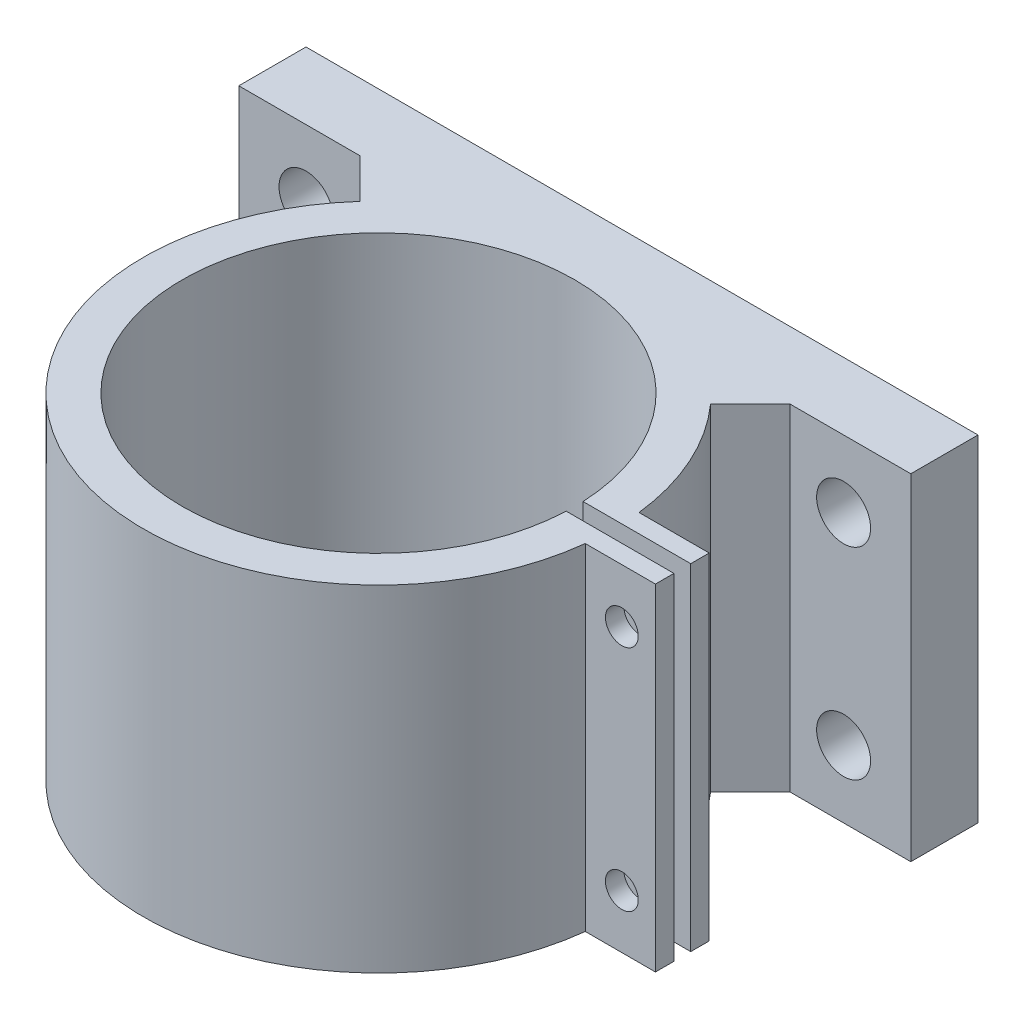
ISO-10303-21;
HEADER;
FILE_DESCRIPTION(('STEP AP214'),'2;1');
FILE_NAME('part.step','',(''),(''),'','','');
FILE_SCHEMA(('AUTOMOTIVE_DESIGN { 1 0 10303 214 1 1 1 1 }'));
ENDSEC;
DATA;
#1=APPLICATION_CONTEXT('core data for automotive mechanical design processes');
#2=APPLICATION_PROTOCOL_DEFINITION('international standard','automotive_design',2000,#1);
#3=PRODUCT_CONTEXT('',#1,'mechanical');
#4=PRODUCT('Part','Part','',(#3));
#5=PRODUCT_RELATED_PRODUCT_CATEGORY('part','',(#4));
#6=PRODUCT_DEFINITION_FORMATION('','',#4);
#7=PRODUCT_DEFINITION_CONTEXT('part definition',#1,'design');
#8=PRODUCT_DEFINITION('design','',#6,#7);
#9=PRODUCT_DEFINITION_SHAPE('','',#8);
#10=(LENGTH_UNIT() NAMED_UNIT(*) SI_UNIT(.MILLI.,.METRE.));
#11=(NAMED_UNIT(*) PLANE_ANGLE_UNIT() SI_UNIT($,.RADIAN.));
#12=(NAMED_UNIT(*) SI_UNIT($,.STERADIAN.) SOLID_ANGLE_UNIT());
#13=UNCERTAINTY_MEASURE_WITH_UNIT(LENGTH_MEASURE(1.E-05),#10,'distance_accuracy_value','');
#14=(GEOMETRIC_REPRESENTATION_CONTEXT(3) GLOBAL_UNCERTAINTY_ASSIGNED_CONTEXT((#13)) GLOBAL_UNIT_ASSIGNED_CONTEXT((#10,
#11,#12)) REPRESENTATION_CONTEXT('',''));
#15=CARTESIAN_POINT('',(0.,0.,0.));
#16=DIRECTION('',(0.,0.,1.));
#17=DIRECTION('',(1.,0.,0.));
#18=AXIS2_PLACEMENT_3D('',#15,#16,#17);
#19=CARTESIAN_POINT('',(28.71,31.75,0.));
#20=DIRECTION('',(1.,0.,0.));
#21=DIRECTION('',(0.,0.,-1.));
#22=AXIS2_PLACEMENT_3D('',#19,#20,#21);
#23=PLANE('',#22);
#24=DIRECTION('',(0.,-1.,0.));
#25=VECTOR('',#24,1.);
#26=CARTESIAN_POINT('',(28.71,31.75,0.79375));
#27=LINE('',#26,#25);
#28=CARTESIAN_POINT('',(28.71,31.75,0.79375));
#29=VERTEX_POINT('',#28);
#30=CARTESIAN_POINT('',(28.71,0.,0.79375));
#31=VERTEX_POINT('',#30);
#32=EDGE_CURVE('E64',#29,#31,#27,.T.);
#33=ORIENTED_EDGE('',*,*,#32,.F.);
#34=DIRECTION('',(0.,0.,1.));
#35=VECTOR('',#34,1.);
#36=CARTESIAN_POINT('',(28.71,31.75,0.));
#37=LINE('',#36,#35);
#38=CARTESIAN_POINT('',(28.71,31.75,2.54));
#39=VERTEX_POINT('',#38);
#40=EDGE_CURVE('E177',#29,#39,#37,.T.);
#41=ORIENTED_EDGE('',*,*,#40,.T.);
#42=DIRECTION('',(0.,-1.,0.));
#43=VECTOR('',#42,1.);
#44=CARTESIAN_POINT('',(28.71,31.75,2.54));
#45=LINE('',#44,#43);
#46=CARTESIAN_POINT('',(28.71,0.,2.54));
#47=VERTEX_POINT('',#46);
#48=EDGE_CURVE('E230',#39,#47,#45,.T.);
#49=ORIENTED_EDGE('',*,*,#48,.T.);
#50=DIRECTION('',(0.,0.,1.));
#51=VECTOR('',#50,1.);
#52=CARTESIAN_POINT('',(28.71,0.,0.));
#53=LINE('',#52,#51);
#54=EDGE_CURVE('E213',#31,#47,#53,.T.);
#55=ORIENTED_EDGE('',*,*,#54,.F.);
#56=EDGE_LOOP('',(#33,#41,#49,#55));
#57=FACE_BOUND('',#56,.T.);
#58=ADVANCED_FACE('F39',(#57),#23,.T.);
#59=CARTESIAN_POINT('',(0.884999999999858,31.75,0.884999999999871));
#60=DIRECTION('',(0.707106781186543,0.,0.707106781186552));
#61=DIRECTION('',(0.707106781186552,0.,-0.707106781186543));
#62=AXIS2_PLACEMENT_3D('',#59,#60,#61);
#63=PLANE('',#62);
#64=DIRECTION('',(-0.707106781186552,0.,0.707106781186543));
#65=VECTOR('',#64,1.);
#66=CARTESIAN_POINT('',(0.884999999999858,0.,0.884999999999871));
#67=LINE('',#66,#65);
#68=CARTESIAN_POINT('',(20.32,0.,-18.55));
#69=VERTEX_POINT('',#68);
#70=CARTESIAN_POINT('',(16.5755094722893,0.,-14.8055094722893));
#71=VERTEX_POINT('',#70);
#72=EDGE_CURVE('E188',#69,#71,#67,.T.);
#73=ORIENTED_EDGE('',*,*,#72,.F.);
#74=DIRECTION('',(0.,-1.,0.));
#75=VECTOR('',#74,1.);
#76=CARTESIAN_POINT('',(20.32,31.75,-18.55));
#77=LINE('',#76,#75);
#78=CARTESIAN_POINT('',(20.32,31.75,-18.55));
#79=VERTEX_POINT('',#78);
#80=EDGE_CURVE('E249',#79,#69,#77,.T.);
#81=ORIENTED_EDGE('',*,*,#80,.F.);
#82=DIRECTION('',(-0.707106781186552,0.,0.707106781186543));
#83=VECTOR('',#82,1.);
#84=CARTESIAN_POINT('',(0.884999999999858,31.75,0.884999999999871));
#85=LINE('',#84,#83);
#86=CARTESIAN_POINT('',(16.5755094722893,31.75,-14.8055094722893));
#87=VERTEX_POINT('',#86);
#88=EDGE_CURVE('E225',#79,#87,#85,.T.);
#89=ORIENTED_EDGE('',*,*,#88,.T.);
#90=DIRECTION('',(0.,-1.,0.));
#91=VECTOR('',#90,1.);
#92=CARTESIAN_POINT('',(16.5755094722893,31.75,-14.8055094722893));
#93=LINE('',#92,#91);
#94=EDGE_CURVE('E187',#87,#71,#93,.T.);
#95=ORIENTED_EDGE('',*,*,#94,.T.);
#96=EDGE_LOOP('',(#73,#81,#89,#95));
#97=FACE_BOUND('',#96,.T.);
#98=ADVANCED_FACE('F41',(#97),#63,.T.);
#99=CARTESIAN_POINT('',(0.,31.75,-18.55));
#100=DIRECTION('',(0.,0.,-1.));
#101=DIRECTION('',(-1.,0.,0.));
#102=AXIS2_PLACEMENT_3D('',#99,#100,#101);
#103=PLANE('',#102);
#104=CARTESIAN_POINT('',(25.4,6.35000000000001,-18.55));
#105=DIRECTION('',(0.,0.,1.));
#106=DIRECTION('',(1.,0.,0.));
#107=AXIS2_PLACEMENT_3D('',#104,#105,#106);
#108=CIRCLE('',#107,2.55);
#109=CARTESIAN_POINT('',(27.95,6.35000000000001,-18.55));
#110=VERTEX_POINT('',#109);
#111=EDGE_CURVE('E397',#110,#110,#108,.T.);
#112=ORIENTED_EDGE('',*,*,#111,.F.);
#113=EDGE_LOOP('',(#112));
#114=FACE_BOUND('',#113,.T.);
#115=CARTESIAN_POINT('',(25.4,25.4,-18.55));
#116=DIRECTION('',(0.,0.,1.));
#117=DIRECTION('',(1.,0.,0.));
#118=AXIS2_PLACEMENT_3D('',#115,#116,#117);
#119=CIRCLE('',#118,2.55);
#120=CARTESIAN_POINT('',(27.95,25.4,-18.55));
#121=VERTEX_POINT('',#120);
#122=EDGE_CURVE('E401',#121,#121,#119,.T.);
#123=ORIENTED_EDGE('',*,*,#122,.F.);
#124=EDGE_LOOP('',(#123));
#125=FACE_BOUND('',#124,.T.);
#126=DIRECTION('',(1.,0.,0.));
#127=VECTOR('',#126,1.);
#128=CARTESIAN_POINT('',(0.,0.,-18.55));
#129=LINE('',#128,#127);
#130=CARTESIAN_POINT('',(31.75,0.,-18.55));
#131=VERTEX_POINT('',#130);
#132=EDGE_CURVE('E191',#69,#131,#129,.T.);
#133=ORIENTED_EDGE('',*,*,#132,.T.);
#134=DIRECTION('',(0.,-1.,0.));
#135=VECTOR('',#134,1.);
#136=CARTESIAN_POINT('',(31.75,31.75,-18.55));
#137=LINE('',#136,#135);
#138=CARTESIAN_POINT('',(31.75,31.75,-18.55));
#139=VERTEX_POINT('',#138);
#140=EDGE_CURVE('E247',#139,#131,#137,.T.);
#141=ORIENTED_EDGE('',*,*,#140,.F.);
#142=DIRECTION('',(1.,0.,0.));
#143=VECTOR('',#142,1.);
#144=CARTESIAN_POINT('',(0.,31.75,-18.55));
#145=LINE('',#144,#143);
#146=EDGE_CURVE('E296',#79,#139,#145,.T.);
#147=ORIENTED_EDGE('',*,*,#146,.F.);
#148=ORIENTED_EDGE('',*,*,#80,.T.);
#149=EDGE_LOOP('',(#133,#141,#147,#148));
#150=FACE_BOUND('',#149,.T.);
#151=ADVANCED_FACE('F350',(#114,#125,#150),#103,.F.);
#152=CARTESIAN_POINT('',(31.75,31.75,0.));
#153=DIRECTION('',(1.,0.,0.));
#154=DIRECTION('',(0.,0.,-1.));
#155=AXIS2_PLACEMENT_3D('',#152,#153,#154);
#156=PLANE('',#155);
#157=DIRECTION('',(0.,0.,1.));
#158=VECTOR('',#157,1.);
#159=CARTESIAN_POINT('',(31.75,0.,0.));
#160=LINE('',#159,#158);
#161=CARTESIAN_POINT('',(31.75,0.,-24.9));
#162=VERTEX_POINT('',#161);
#163=EDGE_CURVE('E194',#162,#131,#160,.T.);
#164=ORIENTED_EDGE('',*,*,#163,.F.);
#165=DIRECTION('',(0.,-1.,0.));
#166=VECTOR('',#165,1.);
#167=CARTESIAN_POINT('',(31.75,31.75,-24.9));
#168=LINE('',#167,#166);
#169=CARTESIAN_POINT('',(31.75,31.75,-24.9));
#170=VERTEX_POINT('',#169);
#171=EDGE_CURVE('E245',#170,#162,#168,.T.);
#172=ORIENTED_EDGE('',*,*,#171,.F.);
#173=DIRECTION('',(0.,0.,1.));
#174=VECTOR('',#173,1.);
#175=CARTESIAN_POINT('',(31.75,31.75,0.));
#176=LINE('',#175,#174);
#177=EDGE_CURVE('E298',#170,#139,#176,.T.);
#178=ORIENTED_EDGE('',*,*,#177,.T.);
#179=ORIENTED_EDGE('',*,*,#140,.T.);
#180=EDGE_LOOP('',(#164,#172,#178,#179));
#181=FACE_BOUND('',#180,.T.);
#182=ADVANCED_FACE('F385',(#181),#156,.T.);
#183=CARTESIAN_POINT('',(0.,31.75,-24.9));
#184=DIRECTION('',(0.,0.,-1.));
#185=DIRECTION('',(-1.,0.,0.));
#186=AXIS2_PLACEMENT_3D('',#183,#184,#185);
#187=PLANE('',#186);
#188=CARTESIAN_POINT('',(25.4,6.35000000000001,-24.9));
#189=DIRECTION('',(0.,0.,-1.));
#190=DIRECTION('',(-1.,0.,0.));
#191=AXIS2_PLACEMENT_3D('',#188,#189,#190);
#192=CIRCLE('',#191,2.55);
#193=CARTESIAN_POINT('',(22.85,6.35000000000001,-24.9));
#194=VERTEX_POINT('',#193);
#195=EDGE_CURVE('E43',#194,#194,#192,.T.);
#196=ORIENTED_EDGE('',*,*,#195,.F.);
#197=EDGE_LOOP('',(#196));
#198=FACE_BOUND('',#197,.T.);
#199=CARTESIAN_POINT('',(25.4,25.4,-24.9));
#200=DIRECTION('',(0.,0.,-1.));
#201=DIRECTION('',(-1.,0.,0.));
#202=AXIS2_PLACEMENT_3D('',#199,#200,#201);
#203=CIRCLE('',#202,2.55);
#204=CARTESIAN_POINT('',(22.85,25.4,-24.9));
#205=VERTEX_POINT('',#204);
#206=EDGE_CURVE('E259',#205,#205,#203,.T.);
#207=ORIENTED_EDGE('',*,*,#206,.F.);
#208=EDGE_LOOP('',(#207));
#209=FACE_BOUND('',#208,.T.);
#210=CARTESIAN_POINT('',(-25.4,25.4,-24.9));
#211=DIRECTION('',(0.,0.,-1.));
#212=DIRECTION('',(-1.,0.,0.));
#213=AXIS2_PLACEMENT_3D('',#210,#211,#212);
#214=CIRCLE('',#213,2.55);
#215=CARTESIAN_POINT('',(-27.95,25.4,-24.9));
#216=VERTEX_POINT('',#215);
#217=EDGE_CURVE('E261',#216,#216,#214,.T.);
#218=ORIENTED_EDGE('',*,*,#217,.F.);
#219=EDGE_LOOP('',(#218));
#220=FACE_BOUND('',#219,.T.);
#221=CARTESIAN_POINT('',(-25.4,6.35,-24.9));
#222=DIRECTION('',(0.,0.,-1.));
#223=DIRECTION('',(-1.,0.,0.));
#224=AXIS2_PLACEMENT_3D('',#221,#222,#223);
#225=CIRCLE('',#224,2.55);
#226=CARTESIAN_POINT('',(-27.95,6.35,-24.9));
#227=VERTEX_POINT('',#226);
#228=EDGE_CURVE('E267',#227,#227,#225,.T.);
#229=ORIENTED_EDGE('',*,*,#228,.F.);
#230=EDGE_LOOP('',(#229));
#231=FACE_BOUND('',#230,.T.);
#232=DIRECTION('',(1.,0.,0.));
#233=VECTOR('',#232,1.);
#234=CARTESIAN_POINT('',(0.,0.,-24.9));
#235=LINE('',#234,#233);
#236=CARTESIAN_POINT('',(-31.75,0.,-24.9));
#237=VERTEX_POINT('',#236);
#238=EDGE_CURVE('E197',#237,#162,#235,.T.);
#239=ORIENTED_EDGE('',*,*,#238,.F.);
#240=DIRECTION('',(0.,-1.,0.));
#241=VECTOR('',#240,1.);
#242=CARTESIAN_POINT('',(-31.75,31.75,-24.9));
#243=LINE('',#242,#241);
#244=CARTESIAN_POINT('',(-31.75,31.75,-24.9));
#245=VERTEX_POINT('',#244);
#246=EDGE_CURVE('E243',#245,#237,#243,.T.);
#247=ORIENTED_EDGE('',*,*,#246,.F.);
#248=DIRECTION('',(1.,0.,0.));
#249=VECTOR('',#248,1.);
#250=CARTESIAN_POINT('',(0.,31.75,-24.9));
#251=LINE('',#250,#249);
#252=EDGE_CURVE('E301',#245,#170,#251,.T.);
#253=ORIENTED_EDGE('',*,*,#252,.T.);
#254=ORIENTED_EDGE('',*,*,#171,.T.);
#255=EDGE_LOOP('',(#239,#247,#253,#254));
#256=FACE_BOUND('',#255,.T.);
#257=ADVANCED_FACE('F381',(#198,#209,#220,#231,#256),#187,.T.);
#258=CARTESIAN_POINT('',(-31.75,31.75,0.));
#259=DIRECTION('',(-1.,0.,0.));
#260=DIRECTION('',(0.,0.,1.));
#261=AXIS2_PLACEMENT_3D('',#258,#259,#260);
#262=PLANE('',#261);
#263=DIRECTION('',(0.,0.,-1.));
#264=VECTOR('',#263,1.);
#265=CARTESIAN_POINT('',(-31.75,0.,0.));
#266=LINE('',#265,#264);
#267=CARTESIAN_POINT('',(-31.75,0.,-18.55));
#268=VERTEX_POINT('',#267);
#269=EDGE_CURVE('E200',#268,#237,#266,.T.);
#270=ORIENTED_EDGE('',*,*,#269,.F.);
#271=DIRECTION('',(0.,-1.,0.));
#272=VECTOR('',#271,1.);
#273=CARTESIAN_POINT('',(-31.75,31.75,-18.55));
#274=LINE('',#273,#272);
#275=CARTESIAN_POINT('',(-31.75,31.75,-18.55));
#276=VERTEX_POINT('',#275);
#277=EDGE_CURVE('E241',#276,#268,#274,.T.);
#278=ORIENTED_EDGE('',*,*,#277,.F.);
#279=DIRECTION('',(0.,0.,-1.));
#280=VECTOR('',#279,1.);
#281=CARTESIAN_POINT('',(-31.75,31.75,0.));
#282=LINE('',#281,#280);
#283=EDGE_CURVE('E304',#276,#245,#282,.T.);
#284=ORIENTED_EDGE('',*,*,#283,.T.);
#285=ORIENTED_EDGE('',*,*,#246,.T.);
#286=EDGE_LOOP('',(#270,#278,#284,#285));
#287=FACE_BOUND('',#286,.T.);
#288=ADVANCED_FACE('F377',(#287),#262,.T.);
#289=CARTESIAN_POINT('',(0.,31.75,-18.55));
#290=DIRECTION('',(0.,0.,1.));
#291=DIRECTION('',(1.,0.,0.));
#292=AXIS2_PLACEMENT_3D('',#289,#290,#291);
#293=PLANE('',#292);
#294=CARTESIAN_POINT('',(-25.4,25.4,-18.55));
#295=DIRECTION('',(0.,0.,1.));
#296=DIRECTION('',(1.,0.,0.));
#297=AXIS2_PLACEMENT_3D('',#294,#295,#296);
#298=CIRCLE('',#297,2.55);
#299=CARTESIAN_POINT('',(-22.85,25.4,-18.55));
#300=VERTEX_POINT('',#299);
#301=EDGE_CURVE('E426',#300,#300,#298,.T.);
#302=ORIENTED_EDGE('',*,*,#301,.F.);
#303=EDGE_LOOP('',(#302));
#304=FACE_BOUND('',#303,.T.);
#305=CARTESIAN_POINT('',(-25.4,6.35,-18.55));
#306=DIRECTION('',(0.,0.,1.));
#307=DIRECTION('',(1.,0.,0.));
#308=AXIS2_PLACEMENT_3D('',#305,#306,#307);
#309=CIRCLE('',#308,2.55);
#310=CARTESIAN_POINT('',(-22.85,6.35,-18.55));
#311=VERTEX_POINT('',#310);
#312=EDGE_CURVE('E272',#311,#311,#309,.T.);
#313=ORIENTED_EDGE('',*,*,#312,.F.);
#314=EDGE_LOOP('',(#313));
#315=FACE_BOUND('',#314,.T.);
#316=DIRECTION('',(-1.,0.,0.));
#317=VECTOR('',#316,1.);
#318=CARTESIAN_POINT('',(0.,0.,-18.55));
#319=LINE('',#318,#317);
#320=CARTESIAN_POINT('',(-20.32,0.,-18.55));
#321=VERTEX_POINT('',#320);
#322=EDGE_CURVE('E203',#321,#268,#319,.T.);
#323=ORIENTED_EDGE('',*,*,#322,.F.);
#324=DIRECTION('',(0.,-1.,0.));
#325=VECTOR('',#324,1.);
#326=CARTESIAN_POINT('',(-20.32,31.75,-18.55));
#327=LINE('',#326,#325);
#328=CARTESIAN_POINT('',(-20.32,31.75,-18.55));
#329=VERTEX_POINT('',#328);
#330=EDGE_CURVE('E239',#329,#321,#327,.T.);
#331=ORIENTED_EDGE('',*,*,#330,.F.);
#332=DIRECTION('',(-1.,0.,0.));
#333=VECTOR('',#332,1.);
#334=CARTESIAN_POINT('',(0.,31.75,-18.55));
#335=LINE('',#334,#333);
#336=EDGE_CURVE('E307',#329,#276,#335,.T.);
#337=ORIENTED_EDGE('',*,*,#336,.T.);
#338=ORIENTED_EDGE('',*,*,#277,.T.);
#339=EDGE_LOOP('',(#323,#331,#337,#338));
#340=FACE_BOUND('',#339,.T.);
#341=ADVANCED_FACE('F373',(#304,#315,#340),#293,.T.);
#342=CARTESIAN_POINT('',(-0.884999999999903,31.75,0.884999999999912));
#343=DIRECTION('',(0.707106781186544,0.,-0.707106781186551));
#344=DIRECTION('',(-0.707106781186551,0.,-0.707106781186544));
#345=AXIS2_PLACEMENT_3D('',#342,#343,#344);
#346=PLANE('',#345);
#347=DIRECTION('',(0.707106781186551,0.,0.707106781186544));
#348=VECTOR('',#347,1.);
#349=CARTESIAN_POINT('',(-0.884999999999903,0.,0.884999999999912));
#350=LINE('',#349,#348);
#351=CARTESIAN_POINT('',(-16.5755094722893,0.,-14.8055094722893));
#352=VERTEX_POINT('',#351);
#353=EDGE_CURVE('E206',#321,#352,#350,.T.);
#354=ORIENTED_EDGE('',*,*,#353,.T.);
#355=DIRECTION('',(0.,-1.,0.));
#356=VECTOR('',#355,1.);
#357=CARTESIAN_POINT('',(-16.5755094722893,31.75,-14.8055094722893));
#358=LINE('',#357,#356);
#359=CARTESIAN_POINT('',(-16.5755094722893,31.75,-14.8055094722893));
#360=VERTEX_POINT('',#359);
#361=EDGE_CURVE('E236',#360,#352,#358,.T.);
#362=ORIENTED_EDGE('',*,*,#361,.F.);
#363=DIRECTION('',(0.707106781186551,0.,0.707106781186544));
#364=VECTOR('',#363,1.);
#365=CARTESIAN_POINT('',(-0.884999999999903,31.75,0.884999999999912));
#366=LINE('',#365,#364);
#367=EDGE_CURVE('E310',#329,#360,#366,.T.);
#368=ORIENTED_EDGE('',*,*,#367,.F.);
#369=ORIENTED_EDGE('',*,*,#330,.T.);
#370=EDGE_LOOP('',(#354,#362,#368,#369));
#371=FACE_BOUND('',#370,.T.);
#372=ADVANCED_FACE('F365',(#371),#346,.F.);
#373=CARTESIAN_POINT('',(0.,31.75,0.));
#374=DIRECTION('',(0.,-1.,0.));
#375=DIRECTION('',(0.,0.,-1.));
#376=AXIS2_PLACEMENT_3D('',#373,#374,#375);
#377=CYLINDRICAL_SURFACE('',#376,22.225);
#378=CARTESIAN_POINT('',(0.,0.,0.));
#379=DIRECTION('',(0.,1.,0.));
#380=DIRECTION('',(0.,0.,1.));
#381=AXIS2_PLACEMENT_3D('',#378,#379,#380);
#382=CIRCLE('',#381,22.225);
#383=CARTESIAN_POINT('',(22.0793800864064,0.,2.54));
#384=VERTEX_POINT('',#383);
#385=EDGE_CURVE('E208',#352,#384,#382,.T.);
#386=ORIENTED_EDGE('',*,*,#385,.T.);
#387=DIRECTION('',(0.,-1.,0.));
#388=VECTOR('',#387,1.);
#389=CARTESIAN_POINT('',(22.0793800864064,31.75,2.54));
#390=LINE('',#389,#388);
#391=CARTESIAN_POINT('',(22.0793800864064,31.75,2.54));
#392=VERTEX_POINT('',#391);
#393=EDGE_CURVE('E233',#392,#384,#390,.T.);
#394=ORIENTED_EDGE('',*,*,#393,.F.);
#395=CARTESIAN_POINT('',(0.,31.75,0.));
#396=DIRECTION('',(0.,1.,0.));
#397=DIRECTION('',(0.,0.,1.));
#398=AXIS2_PLACEMENT_3D('',#395,#396,#397);
#399=CIRCLE('',#398,22.225);
#400=EDGE_CURVE('E311',#360,#392,#399,.T.);
#401=ORIENTED_EDGE('',*,*,#400,.F.);
#402=ORIENTED_EDGE('',*,*,#361,.T.);
#403=EDGE_LOOP('',(#386,#394,#401,#402));
#404=FACE_BOUND('',#403,.T.);
#405=ADVANCED_FACE('F359',(#404),#377,.T.);
#406=CARTESIAN_POINT('',(0.,31.75,2.54));
#407=DIRECTION('',(0.,0.,-1.));
#408=DIRECTION('',(-1.,0.,0.));
#409=AXIS2_PLACEMENT_3D('',#406,#407,#408);
#410=PLANE('',#409);
#411=CARTESIAN_POINT('',(25.535,5.08,2.54));
#412=DIRECTION('',(0.,0.,1.));
#413=DIRECTION('',(1.,0.,0.));
#414=AXIS2_PLACEMENT_3D('',#411,#412,#413);
#415=CIRCLE('',#414,1.55);
#416=CARTESIAN_POINT('',(27.085,5.08,2.54));
#417=VERTEX_POINT('',#416);
#418=EDGE_CURVE('E276',#417,#417,#415,.T.);
#419=ORIENTED_EDGE('',*,*,#418,.F.);
#420=EDGE_LOOP('',(#419));
#421=FACE_BOUND('',#420,.T.);
#422=CARTESIAN_POINT('',(25.535,26.67,2.54));
#423=DIRECTION('',(0.,0.,1.));
#424=DIRECTION('',(1.,0.,0.));
#425=AXIS2_PLACEMENT_3D('',#422,#423,#424);
#426=CIRCLE('',#425,1.55);
#427=CARTESIAN_POINT('',(27.085,26.67,2.54));
#428=VERTEX_POINT('',#427);
#429=EDGE_CURVE('E265',#428,#428,#426,.T.);
#430=ORIENTED_EDGE('',*,*,#429,.F.);
#431=EDGE_LOOP('',(#430));
#432=FACE_BOUND('',#431,.T.);
#433=DIRECTION('',(1.,0.,0.));
#434=VECTOR('',#433,1.);
#435=CARTESIAN_POINT('',(0.,0.,2.54));
#436=LINE('',#435,#434);
#437=EDGE_CURVE('E210',#384,#47,#436,.T.);
#438=ORIENTED_EDGE('',*,*,#437,.T.);
#439=ORIENTED_EDGE('',*,*,#48,.F.);
#440=DIRECTION('',(1.,0.,0.));
#441=VECTOR('',#440,1.);
#442=CARTESIAN_POINT('',(0.,31.75,2.54));
#443=LINE('',#442,#441);
#444=EDGE_CURVE('E181',#392,#39,#443,.T.);
#445=ORIENTED_EDGE('',*,*,#444,.F.);
#446=ORIENTED_EDGE('',*,*,#393,.T.);
#447=EDGE_LOOP('',(#438,#439,#445,#446));
#448=FACE_BOUND('',#447,.T.);
#449=ADVANCED_FACE('F319',(#421,#432,#448),#410,.F.);
#450=DIRECTION('',(0.,1.,0.));
#451=VECTOR('',#450,1.);
#452=CARTESIAN_POINT('',(28.71,31.75,-0.79375));
#453=LINE('',#452,#451);
#454=CARTESIAN_POINT('',(28.71,0.,-0.79375));
#455=VERTEX_POINT('',#454);
#456=CARTESIAN_POINT('',(28.71,31.75,-0.79375));
#457=VERTEX_POINT('',#456);
#458=EDGE_CURVE('E151',#455,#457,#453,.T.);
#459=ORIENTED_EDGE('',*,*,#458,.F.);
#460=CARTESIAN_POINT('',(28.71,0.,-2.54));
#461=VERTEX_POINT('',#460);
#462=EDGE_CURVE('E214',#461,#455,#53,.T.);
#463=ORIENTED_EDGE('',*,*,#462,.F.);
#464=DIRECTION('',(0.,-1.,0.));
#465=VECTOR('',#464,1.);
#466=CARTESIAN_POINT('',(28.71,31.75,-2.54));
#467=LINE('',#466,#465);
#468=CARTESIAN_POINT('',(28.71,31.75,-2.54));
#469=VERTEX_POINT('',#468);
#470=EDGE_CURVE('E175',#469,#461,#467,.T.);
#471=ORIENTED_EDGE('',*,*,#470,.F.);
#472=EDGE_CURVE('E167',#469,#457,#37,.T.);
#473=ORIENTED_EDGE('',*,*,#472,.T.);
#474=EDGE_LOOP('',(#459,#463,#471,#473));
#475=FACE_BOUND('',#474,.T.);
#476=ADVANCED_FACE('F174',(#475),#23,.T.);
#477=CARTESIAN_POINT('',(0.,31.75,-2.54));
#478=DIRECTION('',(0.,0.,-1.));
#479=DIRECTION('',(-1.,0.,0.));
#480=AXIS2_PLACEMENT_3D('',#477,#478,#479);
#481=PLANE('',#480);
#482=CARTESIAN_POINT('',(25.535,5.08,-2.54));
#483=DIRECTION('',(0.,0.,-1.));
#484=DIRECTION('',(-1.,0.,0.));
#485=AXIS2_PLACEMENT_3D('',#482,#483,#484);
#486=CIRCLE('',#485,1.55);
#487=CARTESIAN_POINT('',(23.985,5.08,-2.54));
#488=VERTEX_POINT('',#487);
#489=EDGE_CURVE('E256',#488,#488,#486,.F.);
#490=ORIENTED_EDGE('',*,*,#489,.T.);
#491=EDGE_LOOP('',(#490));
#492=FACE_BOUND('',#491,.T.);
#493=CARTESIAN_POINT('',(25.535,26.67,-2.54));
#494=DIRECTION('',(0.,0.,-1.));
#495=DIRECTION('',(-1.,0.,0.));
#496=AXIS2_PLACEMENT_3D('',#493,#494,#495);
#497=CIRCLE('',#496,1.55);
#498=CARTESIAN_POINT('',(23.985,26.67,-2.54));
#499=VERTEX_POINT('',#498);
#500=EDGE_CURVE('E279',#499,#499,#497,.F.);
#501=ORIENTED_EDGE('',*,*,#500,.T.);
#502=EDGE_LOOP('',(#501));
#503=FACE_BOUND('',#502,.T.);
#504=DIRECTION('',(1.,0.,0.));
#505=VECTOR('',#504,1.);
#506=CARTESIAN_POINT('',(0.,0.,-2.54));
#507=LINE('',#506,#505);
#508=CARTESIAN_POINT('',(22.0793800864064,0.,-2.54));
#509=VERTEX_POINT('',#508);
#510=EDGE_CURVE('E216',#509,#461,#507,.T.);
#511=ORIENTED_EDGE('',*,*,#510,.F.);
#512=DIRECTION('',(0.,-1.,0.));
#513=VECTOR('',#512,1.);
#514=CARTESIAN_POINT('',(22.0793800864064,31.75,-2.54));
#515=LINE('',#514,#513);
#516=CARTESIAN_POINT('',(22.0793800864064,31.75,-2.54));
#517=VERTEX_POINT('',#516);
#518=EDGE_CURVE('E227',#517,#509,#515,.T.);
#519=ORIENTED_EDGE('',*,*,#518,.F.);
#520=DIRECTION('',(1.,0.,0.));
#521=VECTOR('',#520,1.);
#522=CARTESIAN_POINT('',(0.,31.75,-2.54));
#523=LINE('',#522,#521);
#524=EDGE_CURVE('E176',#517,#469,#523,.T.);
#525=ORIENTED_EDGE('',*,*,#524,.T.);
#526=ORIENTED_EDGE('',*,*,#470,.T.);
#527=EDGE_LOOP('',(#511,#519,#525,#526));
#528=FACE_BOUND('',#527,.T.);
#529=ADVANCED_FACE('F340',(#492,#503,#528),#481,.T.);
#530=CARTESIAN_POINT('',(0.,31.75,0.));
#531=DIRECTION('',(0.,-1.,0.));
#532=DIRECTION('',(0.,0.,-1.));
#533=AXIS2_PLACEMENT_3D('',#530,#531,#532);
#534=CYLINDRICAL_SURFACE('',#533,22.225);
#535=CARTESIAN_POINT('',(0.,0.,0.));
#536=DIRECTION('',(0.,1.,0.));
#537=DIRECTION('',(0.,0.,1.));
#538=AXIS2_PLACEMENT_3D('',#535,#536,#537);
#539=CIRCLE('',#538,22.225);
#540=EDGE_CURVE('E219',#509,#71,#539,.T.);
#541=ORIENTED_EDGE('',*,*,#540,.T.);
#542=ORIENTED_EDGE('',*,*,#94,.F.);
#543=CARTESIAN_POINT('',(0.,31.75,0.));
#544=DIRECTION('',(0.,1.,0.));
#545=DIRECTION('',(0.,0.,1.));
#546=AXIS2_PLACEMENT_3D('',#543,#544,#545);
#547=CIRCLE('',#546,22.225);
#548=EDGE_CURVE('E179',#517,#87,#547,.T.);
#549=ORIENTED_EDGE('',*,*,#548,.F.);
#550=ORIENTED_EDGE('',*,*,#518,.T.);
#551=EDGE_LOOP('',(#541,#542,#549,#550));
#552=FACE_BOUND('',#551,.T.);
#553=ADVANCED_FACE('F332',(#552),#534,.T.);
#554=CARTESIAN_POINT('',(0.,31.75,0.));
#555=DIRECTION('',(0.,-1.,0.));
#556=DIRECTION('',(0.,0.,-1.));
#557=AXIS2_PLACEMENT_3D('',#554,#555,#556);
#558=CYLINDRICAL_SURFACE('',#557,18.55);
#559=DIRECTION('',(0.,-1.,0.));
#560=VECTOR('',#559,1.);
#561=CARTESIAN_POINT('',(18.5330100344628,31.75,0.79375));
#562=LINE('',#561,#560);
#563=CARTESIAN_POINT('',(18.5330100344628,0.,0.79375));
#564=VERTEX_POINT('',#563);
#565=CARTESIAN_POINT('',(18.5330100344628,31.75,0.79375));
#566=VERTEX_POINT('',#565);
#567=EDGE_CURVE('E159',#564,#566,#562,.F.);
#568=ORIENTED_EDGE('',*,*,#567,.F.);
#569=CARTESIAN_POINT('',(0.,0.,0.));
#570=DIRECTION('',(0.,1.,0.));
#571=DIRECTION('',(0.,0.,1.));
#572=AXIS2_PLACEMENT_3D('',#569,#570,#571);
#573=CIRCLE('',#572,18.55);
#574=CARTESIAN_POINT('',(18.5330100344628,0.,-0.79375));
#575=VERTEX_POINT('',#574);
#576=EDGE_CURVE('E222',#575,#564,#573,.T.);
#577=ORIENTED_EDGE('',*,*,#576,.F.);
#578=DIRECTION('',(0.,-1.,0.));
#579=VECTOR('',#578,1.);
#580=CARTESIAN_POINT('',(18.5330100344628,31.75,-0.79375));
#581=LINE('',#580,#579);
#582=CARTESIAN_POINT('',(18.5330100344628,31.75,-0.79375));
#583=VERTEX_POINT('',#582);
#584=EDGE_CURVE('E56',#583,#575,#581,.T.);
#585=ORIENTED_EDGE('',*,*,#584,.F.);
#586=CARTESIAN_POINT('',(0.,31.75,0.));
#587=DIRECTION('',(0.,1.,0.));
#588=DIRECTION('',(0.,0.,1.));
#589=AXIS2_PLACEMENT_3D('',#586,#587,#588);
#590=CIRCLE('',#589,18.55);
#591=EDGE_CURVE('E170',#583,#566,#590,.T.);
#592=ORIENTED_EDGE('',*,*,#591,.T.);
#593=EDGE_LOOP('',(#568,#577,#585,#592));
#594=FACE_BOUND('',#593,.T.);
#595=ADVANCED_FACE('F330',(#594),#558,.F.);
#596=CARTESIAN_POINT('',(0.,31.75,0.));
#597=DIRECTION('',(0.,1.,0.));
#598=DIRECTION('',(0.,0.,1.));
#599=AXIS2_PLACEMENT_3D('',#596,#597,#598);
#600=PLANE('',#599);
#601=DIRECTION('',(1.,0.,0.));
#602=VECTOR('',#601,1.);
#603=CARTESIAN_POINT('',(11.3208088956704,31.75,0.79375));
#604=LINE('',#603,#602);
#605=EDGE_CURVE('E171',#566,#29,#604,.T.);
#606=ORIENTED_EDGE('',*,*,#605,.F.);
#607=ORIENTED_EDGE('',*,*,#591,.F.);
#608=DIRECTION('',(-1.,0.,0.));
#609=VECTOR('',#608,1.);
#610=CARTESIAN_POINT('',(11.3208088956704,31.75,-0.79375));
#611=LINE('',#610,#609);
#612=EDGE_CURVE('E154',#457,#583,#611,.T.);
#613=ORIENTED_EDGE('',*,*,#612,.F.);
#614=ORIENTED_EDGE('',*,*,#472,.F.);
#615=ORIENTED_EDGE('',*,*,#524,.F.);
#616=ORIENTED_EDGE('',*,*,#548,.T.);
#617=ORIENTED_EDGE('',*,*,#88,.F.);
#618=ORIENTED_EDGE('',*,*,#146,.T.);
#619=ORIENTED_EDGE('',*,*,#177,.F.);
#620=ORIENTED_EDGE('',*,*,#252,.F.);
#621=ORIENTED_EDGE('',*,*,#283,.F.);
#622=ORIENTED_EDGE('',*,*,#336,.F.);
#623=ORIENTED_EDGE('',*,*,#367,.T.);
#624=ORIENTED_EDGE('',*,*,#400,.T.);
#625=ORIENTED_EDGE('',*,*,#444,.T.);
#626=ORIENTED_EDGE('',*,*,#40,.F.);
#627=EDGE_LOOP('',(#606,#607,#613,#614,#615,#616,#617,#618,#619,#620,#621,#622,#623,#624,#625,#626));
#628=FACE_BOUND('',#627,.T.);
#629=ADVANCED_FACE('F165',(#628),#600,.T.);
#630=CARTESIAN_POINT('',(0.,0.,0.));
#631=DIRECTION('',(0.,1.,0.));
#632=DIRECTION('',(0.,0.,1.));
#633=AXIS2_PLACEMENT_3D('',#630,#631,#632);
#634=PLANE('',#633);
#635=ORIENTED_EDGE('',*,*,#576,.T.);
#636=DIRECTION('',(1.,0.,0.));
#637=VECTOR('',#636,1.);
#638=CARTESIAN_POINT('',(0.,0.,0.79375));
#639=LINE('',#638,#637);
#640=EDGE_CURVE('E11',#564,#31,#639,.T.);
#641=ORIENTED_EDGE('',*,*,#640,.T.);
#642=ORIENTED_EDGE('',*,*,#54,.T.);
#643=ORIENTED_EDGE('',*,*,#437,.F.);
#644=ORIENTED_EDGE('',*,*,#385,.F.);
#645=ORIENTED_EDGE('',*,*,#353,.F.);
#646=ORIENTED_EDGE('',*,*,#322,.T.);
#647=ORIENTED_EDGE('',*,*,#269,.T.);
#648=ORIENTED_EDGE('',*,*,#238,.T.);
#649=ORIENTED_EDGE('',*,*,#163,.T.);
#650=ORIENTED_EDGE('',*,*,#132,.F.);
#651=ORIENTED_EDGE('',*,*,#72,.T.);
#652=ORIENTED_EDGE('',*,*,#540,.F.);
#653=ORIENTED_EDGE('',*,*,#510,.T.);
#654=ORIENTED_EDGE('',*,*,#462,.T.);
#655=DIRECTION('',(-1.,0.,0.));
#656=VECTOR('',#655,1.);
#657=CARTESIAN_POINT('',(0.,0.,-0.79375));
#658=LINE('',#657,#656);
#659=EDGE_CURVE('E48',#455,#575,#658,.T.);
#660=ORIENTED_EDGE('',*,*,#659,.T.);
#661=EDGE_LOOP('',(#635,#641,#642,#643,#644,#645,#646,#647,#648,#649,#650,#651,#652,#653,#654,#660));
#662=FACE_BOUND('',#661,.T.);
#663=ADVANCED_FACE('F324',(#662),#634,.F.);
#664=CARTESIAN_POINT('',(11.3208088956704,0.,-0.79375));
#665=DIRECTION('',(0.,0.,-1.));
#666=DIRECTION('',(-1.,0.,0.));
#667=AXIS2_PLACEMENT_3D('',#664,#665,#666);
#668=PLANE('',#667);
#669=CARTESIAN_POINT('',(25.535,5.08,-0.79375));
#670=DIRECTION('',(0.,0.,-1.));
#671=DIRECTION('',(-1.,0.,0.));
#672=AXIS2_PLACEMENT_3D('',#669,#670,#671);
#673=CIRCLE('',#672,1.55);
#674=CARTESIAN_POINT('',(23.985,5.08,-0.79375));
#675=VERTEX_POINT('',#674);
#676=EDGE_CURVE('E172',#675,#675,#673,.T.);
#677=ORIENTED_EDGE('',*,*,#676,.T.);
#678=EDGE_LOOP('',(#677));
#679=FACE_BOUND('',#678,.T.);
#680=CARTESIAN_POINT('',(25.535,26.67,-0.79375));
#681=DIRECTION('',(0.,0.,-1.));
#682=DIRECTION('',(-1.,0.,0.));
#683=AXIS2_PLACEMENT_3D('',#680,#681,#682);
#684=CIRCLE('',#683,1.55);
#685=CARTESIAN_POINT('',(23.985,26.67,-0.79375));
#686=VERTEX_POINT('',#685);
#687=EDGE_CURVE('E255',#686,#686,#684,.T.);
#688=ORIENTED_EDGE('',*,*,#687,.T.);
#689=EDGE_LOOP('',(#688));
#690=FACE_BOUND('',#689,.T.);
#691=ORIENTED_EDGE('',*,*,#458,.T.);
#692=ORIENTED_EDGE('',*,*,#612,.T.);
#693=ORIENTED_EDGE('',*,*,#584,.T.);
#694=ORIENTED_EDGE('',*,*,#659,.F.);
#695=EDGE_LOOP('',(#691,#692,#693,#694));
#696=FACE_BOUND('',#695,.T.);
#697=ADVANCED_FACE('F153',(#679,#690,#696),#668,.F.);
#698=CARTESIAN_POINT('',(11.3208088956704,0.,0.79375));
#699=DIRECTION('',(0.,0.,1.));
#700=DIRECTION('',(1.,0.,0.));
#701=AXIS2_PLACEMENT_3D('',#698,#699,#700);
#702=PLANE('',#701);
#703=CARTESIAN_POINT('',(25.535,5.08,0.793749999999999));
#704=DIRECTION('',(0.,0.,1.));
#705=DIRECTION('',(1.,0.,0.));
#706=AXIS2_PLACEMENT_3D('',#703,#704,#705);
#707=CIRCLE('',#706,1.55);
#708=CARTESIAN_POINT('',(27.085,5.08,0.793749999999999));
#709=VERTEX_POINT('',#708);
#710=EDGE_CURVE('E257',#709,#709,#707,.T.);
#711=ORIENTED_EDGE('',*,*,#710,.T.);
#712=EDGE_LOOP('',(#711));
#713=FACE_BOUND('',#712,.T.);
#714=CARTESIAN_POINT('',(25.535,26.67,0.793749999999999));
#715=DIRECTION('',(0.,0.,1.));
#716=DIRECTION('',(1.,0.,0.));
#717=AXIS2_PLACEMENT_3D('',#714,#715,#716);
#718=CIRCLE('',#717,1.55);
#719=CARTESIAN_POINT('',(27.085,26.67,0.793749999999999));
#720=VERTEX_POINT('',#719);
#721=EDGE_CURVE('E252',#720,#720,#718,.T.);
#722=ORIENTED_EDGE('',*,*,#721,.T.);
#723=EDGE_LOOP('',(#722));
#724=FACE_BOUND('',#723,.T.);
#725=ORIENTED_EDGE('',*,*,#32,.T.);
#726=ORIENTED_EDGE('',*,*,#640,.F.);
#727=ORIENTED_EDGE('',*,*,#567,.T.);
#728=ORIENTED_EDGE('',*,*,#605,.T.);
#729=EDGE_LOOP('',(#725,#726,#727,#728));
#730=FACE_BOUND('',#729,.T.);
#731=ADVANCED_FACE('F328',(#713,#724,#730),#702,.F.);
#732=CARTESIAN_POINT('',(25.535,26.67,-6.9240620433566));
#733=DIRECTION('',(0.,0.,1.));
#734=DIRECTION('',(1.,0.,0.));
#735=AXIS2_PLACEMENT_3D('',#732,#733,#734);
#736=CYLINDRICAL_SURFACE('',#735,1.55);
#737=ORIENTED_EDGE('',*,*,#429,.T.);
#738=EDGE_LOOP('',(#737));
#739=FACE_BOUND('',#738,.T.);
#740=ORIENTED_EDGE('',*,*,#721,.F.);
#741=EDGE_LOOP('',(#740));
#742=FACE_BOUND('',#741,.T.);
#743=ADVANCED_FACE('F458',(#739,#742),#736,.F.);
#744=CARTESIAN_POINT('',(25.535,5.08,-6.9240620433566));
#745=DIRECTION('',(0.,0.,1.));
#746=DIRECTION('',(1.,0.,0.));
#747=AXIS2_PLACEMENT_3D('',#744,#745,#746);
#748=CYLINDRICAL_SURFACE('',#747,1.55);
#749=ORIENTED_EDGE('',*,*,#418,.T.);
#750=EDGE_LOOP('',(#749));
#751=FACE_BOUND('',#750,.T.);
#752=ORIENTED_EDGE('',*,*,#710,.F.);
#753=EDGE_LOOP('',(#752));
#754=FACE_BOUND('',#753,.T.);
#755=ADVANCED_FACE('F450',(#751,#754),#748,.F.);
#756=ORIENTED_EDGE('',*,*,#500,.F.);
#757=EDGE_LOOP('',(#756));
#758=FACE_BOUND('',#757,.T.);
#759=ORIENTED_EDGE('',*,*,#687,.F.);
#760=EDGE_LOOP('',(#759));
#761=FACE_BOUND('',#760,.T.);
#762=ADVANCED_FACE('F447',(#758,#761),#736,.F.);
#763=ORIENTED_EDGE('',*,*,#489,.F.);
#764=EDGE_LOOP('',(#763));
#765=FACE_BOUND('',#764,.T.);
#766=ORIENTED_EDGE('',*,*,#676,.F.);
#767=EDGE_LOOP('',(#766));
#768=FACE_BOUND('',#767,.T.);
#769=ADVANCED_FACE('F438',(#765,#768),#748,.F.);
#770=CARTESIAN_POINT('',(-25.4,6.35,-50.3));
#771=DIRECTION('',(0.,0.,1.));
#772=DIRECTION('',(1.,0.,0.));
#773=AXIS2_PLACEMENT_3D('',#770,#771,#772);
#774=CYLINDRICAL_SURFACE('',#773,2.55);
#775=ORIENTED_EDGE('',*,*,#228,.T.);
#776=EDGE_LOOP('',(#775));
#777=FACE_BOUND('',#776,.T.);
#778=ORIENTED_EDGE('',*,*,#312,.T.);
#779=EDGE_LOOP('',(#778));
#780=FACE_BOUND('',#779,.T.);
#781=ADVANCED_FACE('F434',(#777,#780),#774,.F.);
#782=CARTESIAN_POINT('',(-25.4,25.4,-50.3));
#783=DIRECTION('',(0.,0.,1.));
#784=DIRECTION('',(1.,0.,0.));
#785=AXIS2_PLACEMENT_3D('',#782,#783,#784);
#786=CYLINDRICAL_SURFACE('',#785,2.55);
#787=ORIENTED_EDGE('',*,*,#217,.T.);
#788=EDGE_LOOP('',(#787));
#789=FACE_BOUND('',#788,.T.);
#790=ORIENTED_EDGE('',*,*,#301,.T.);
#791=EDGE_LOOP('',(#790));
#792=FACE_BOUND('',#791,.T.);
#793=ADVANCED_FACE('F437',(#789,#792),#786,.F.);
#794=CARTESIAN_POINT('',(25.4,25.4,-50.3));
#795=DIRECTION('',(0.,0.,1.));
#796=DIRECTION('',(1.,0.,0.));
#797=AXIS2_PLACEMENT_3D('',#794,#795,#796);
#798=CYLINDRICAL_SURFACE('',#797,2.55);
#799=ORIENTED_EDGE('',*,*,#206,.T.);
#800=EDGE_LOOP('',(#799));
#801=FACE_BOUND('',#800,.T.);
#802=ORIENTED_EDGE('',*,*,#122,.T.);
#803=EDGE_LOOP('',(#802));
#804=FACE_BOUND('',#803,.T.);
#805=ADVANCED_FACE('F445',(#801,#804),#798,.F.);
#806=CARTESIAN_POINT('',(25.4,6.35000000000001,-50.3));
#807=DIRECTION('',(0.,0.,1.));
#808=DIRECTION('',(1.,0.,0.));
#809=AXIS2_PLACEMENT_3D('',#806,#807,#808);
#810=CYLINDRICAL_SURFACE('',#809,2.55);
#811=ORIENTED_EDGE('',*,*,#195,.T.);
#812=EDGE_LOOP('',(#811));
#813=FACE_BOUND('',#812,.T.);
#814=ORIENTED_EDGE('',*,*,#111,.T.);
#815=EDGE_LOOP('',(#814));
#816=FACE_BOUND('',#815,.T.);
#817=ADVANCED_FACE('F452',(#813,#816),#810,.F.);
#818=CLOSED_SHELL('',(#58,#98,#151,#182,#257,#288,#341,#372,#405,#449,#476,#529,#553,#595,#629,
#663,#697,#731,#743,#755,#762,#769,#781,#793,#805,#817));
#819=MANIFOLD_SOLID_BREP('B2',#818);
#820=ADVANCED_BREP_SHAPE_REPRESENTATION('',(#18,#819),#14);
#821=SHAPE_DEFINITION_REPRESENTATION(#9,#820);
ENDSEC;
END-ISO-10303-21;
